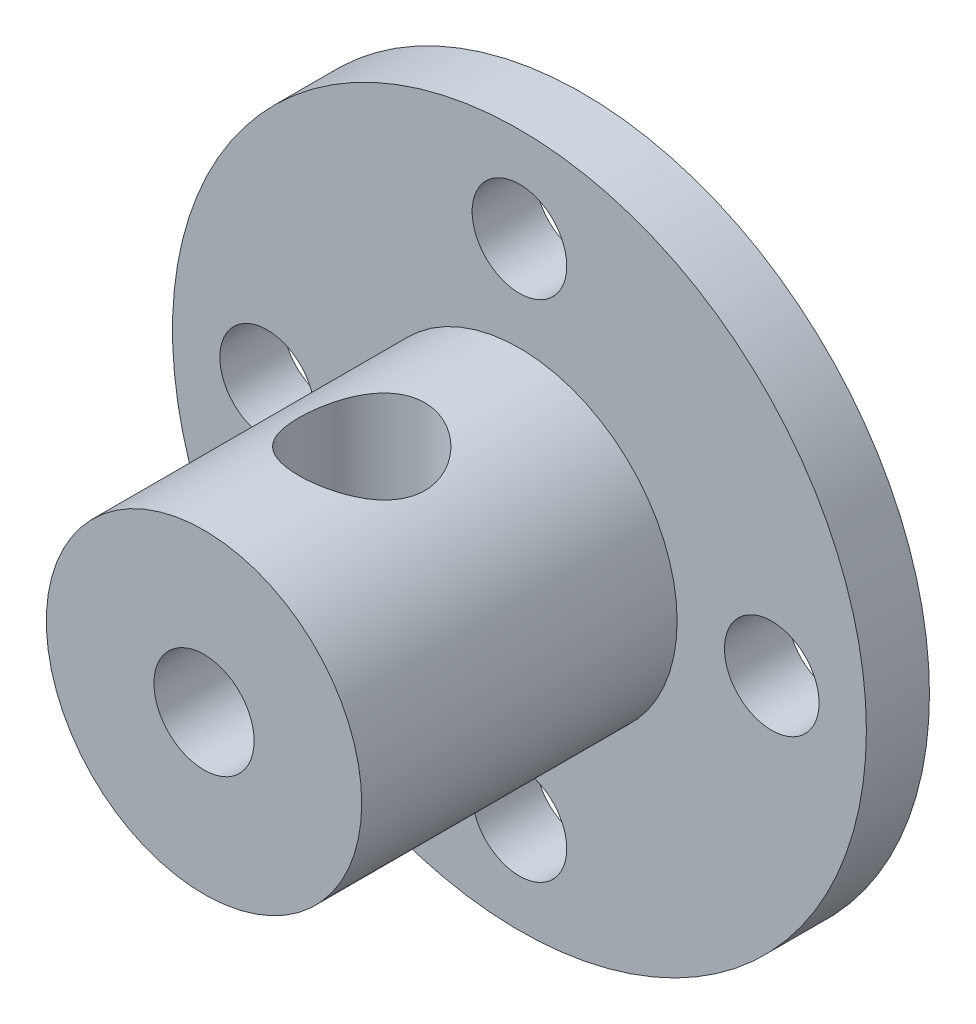
ISO-10303-21;
HEADER;
FILE_DESCRIPTION(('STEP AP214'),'2;1');
FILE_NAME('part.step','',(''),(''),'','','');
FILE_SCHEMA(('AUTOMOTIVE_DESIGN { 1 0 10303 214 1 1 1 1 }'));
ENDSEC;
DATA;
#1=APPLICATION_CONTEXT('core data for automotive mechanical design processes');
#2=APPLICATION_PROTOCOL_DEFINITION('international standard','automotive_design',2000,#1);
#3=PRODUCT_CONTEXT('',#1,'mechanical');
#4=PRODUCT('Part','Part','',(#3));
#5=PRODUCT_RELATED_PRODUCT_CATEGORY('part','',(#4));
#6=PRODUCT_DEFINITION_FORMATION('','',#4);
#7=PRODUCT_DEFINITION_CONTEXT('part definition',#1,'design');
#8=PRODUCT_DEFINITION('design','',#6,#7);
#9=PRODUCT_DEFINITION_SHAPE('','',#8);
#10=(LENGTH_UNIT() NAMED_UNIT(*) SI_UNIT(.MILLI.,.METRE.));
#11=(NAMED_UNIT(*) PLANE_ANGLE_UNIT() SI_UNIT($,.RADIAN.));
#12=(NAMED_UNIT(*) SI_UNIT($,.STERADIAN.) SOLID_ANGLE_UNIT());
#13=UNCERTAINTY_MEASURE_WITH_UNIT(LENGTH_MEASURE(1.E-05),#10,'distance_accuracy_value','');
#14=(GEOMETRIC_REPRESENTATION_CONTEXT(3) GLOBAL_UNCERTAINTY_ASSIGNED_CONTEXT((#13)) GLOBAL_UNIT_ASSIGNED_CONTEXT((#10,
#11,#12)) REPRESENTATION_CONTEXT('',''));
#15=CARTESIAN_POINT('',(0.,0.,0.));
#16=DIRECTION('',(0.,0.,1.));
#17=DIRECTION('',(1.,0.,0.));
#18=AXIS2_PLACEMENT_3D('',#15,#16,#17);
#19=CARTESIAN_POINT('',(0.,0.,12.));
#20=DIRECTION('',(0.,0.,-1.));
#21=DIRECTION('',(-1.,0.,0.));
#22=AXIS2_PLACEMENT_3D('',#19,#20,#21);
#23=CYLINDRICAL_SURFACE('',#22,1.5875);
#24=CARTESIAN_POINT('',(-1.5875,0.,8.21648828601018));
#25=CARTESIAN_POINT('',(-1.58750305562253,-0.0603104231234807,8.21648117451557));
#26=CARTESIAN_POINT('',(-1.58403341273919,-0.120607113947424,8.22105074654465));
#27=CARTESIAN_POINT('',(-1.57050160837506,-0.239301006102673,8.23840219555803));
#28=CARTESIAN_POINT('',(-1.56042477536508,-0.297693675854862,8.25120234764797));
#29=CARTESIAN_POINT('',(-1.52993691230283,-0.4307931648192,8.28842492099147));
#30=CARTESIAN_POINT('',(-1.50716925355557,-0.504242982685079,8.3153258006701));
#31=CARTESIAN_POINT('',(-1.4525517612866,-0.644963985778299,8.37540858645437));
#32=CARTESIAN_POINT('',(-1.42067534202139,-0.712216311150283,8.40860878164218));
#33=CARTESIAN_POINT('',(-1.33613167602197,-0.862998186511905,8.48972030910752));
#34=CARTESIAN_POINT('',(-1.28008952999256,-0.944048850475616,8.53873076113605));
#35=CARTESIAN_POINT('',(-1.15374980106818,-1.09483592992139,8.63560792296001));
#36=CARTESIAN_POINT('',(-1.08346397884354,-1.16458159471853,8.68347554015421));
#37=CARTESIAN_POINT('',(-0.943983199056094,-1.27887198786935,8.76467724439397));
#38=CARTESIAN_POINT('',(-0.877240483818687,-1.32567939628896,8.79902640350233));
#39=CARTESIAN_POINT('',(-0.735218433620621,-1.40938939705036,8.86157140410637));
#40=CARTESIAN_POINT('',(-0.659952550656867,-1.44630729624372,8.88977674213329));
#41=CARTESIAN_POINT('',(-0.514769487060378,-1.50341069028699,8.93386029492071));
#42=CARTESIAN_POINT('',(-0.445916459723263,-1.52532646285682,8.95098757825302));
#43=CARTESIAN_POINT('',(-0.304508928687299,-1.55971595951213,8.97798961044313));
#44=CARTESIAN_POINT('',(-0.231956443892208,-1.57219477598544,8.98786827073075));
#45=CARTESIAN_POINT('',(-0.084914925599208,-1.58695346049022,8.99956104874003));
#46=CARTESIAN_POINT('',(-0.010420259412727,-1.58919930891248,9.00134826625052));
#47=CARTESIAN_POINT('',(0.137881903001722,-1.58324116011758,8.99662040916559));
#48=CARTESIAN_POINT('',(0.211689357224325,-1.57503652829121,8.99010483037984));
#49=CARTESIAN_POINT('',(0.352561894068093,-1.54942494066314,8.96989948250185));
#50=CARTESIAN_POINT('',(0.41977774357743,-1.5325214440992,8.95660253914089));
#51=CARTESIAN_POINT('',(0.55011759343737,-1.49070994591862,8.92402924418418));
#52=CARTESIAN_POINT('',(0.613240570313924,-1.46579995138286,8.90475140390871));
#53=CARTESIAN_POINT('',(0.740387124294535,-1.40619597759525,8.85925339016223));
#54=CARTESIAN_POINT('',(0.803892757711991,-1.37078241648746,8.83253802084516));
#55=CARTESIAN_POINT('',(0.924190514464723,-1.29274029095768,8.77491651295935));
#56=CARTESIAN_POINT('',(0.9809786156286,-1.25010744070461,8.74400788718579));
#57=CARTESIAN_POINT('',(1.09852894108893,-1.14915984971797,8.67298057789703));
#58=CARTESIAN_POINT('',(1.15771236278892,-1.0894226214436,8.63227402151469));
#59=CARTESIAN_POINT('',(1.26580775172051,-0.961717373700508,8.54995008222711));
#60=CARTESIAN_POINT('',(1.31470792779573,-0.893740045043498,8.50833171350587));
#61=CARTESIAN_POINT('',(1.39688646737932,-0.757916686879353,8.432297655293));
#62=CARTESIAN_POINT('',(1.43130458852045,-0.6909201676667,8.39759896112017));
#63=CARTESIAN_POINT('',(1.49094816417341,-0.550475796251658,8.33378143644153));
#64=CARTESIAN_POINT('',(1.51619378102881,-0.477042539648627,8.3046504351143));
#65=CARTESIAN_POINT('',(1.55034106764782,-0.346068068657888,8.26370247242131));
#66=CARTESIAN_POINT('',(1.56185530066664,-0.290033197526718,8.24931546565351));
#67=CARTESIAN_POINT('',(1.5787963156751,-0.175726913483428,8.22784165465501));
#68=CARTESIAN_POINT('',(1.58423601932532,-0.117460521757196,8.22073935711978));
#69=CARTESIAN_POINT('',(1.58859239383669,5.14107138746567E-05,8.21506849756851));
#70=CARTESIAN_POINT('',(1.58747613627424,0.0593004011870496,8.21654301369272));
#71=CARTESIAN_POINT('',(1.57875288709535,0.176535995658533,8.22783702068777));
#72=CARTESIAN_POINT('',(1.57113638242224,0.23452062165419,8.23766874217348));
#73=CARTESIAN_POINT('',(1.5471491288615,0.363113583740965,8.26758811232848));
#74=CARTESIAN_POINT('',(1.52896614690763,0.432887759277852,8.2897322100792));
#75=CARTESIAN_POINT('',(1.48441719099898,0.567185240278004,8.34076600365947));
#76=CARTESIAN_POINT('',(1.45802725362809,0.631692461206863,8.36967539140858));
#77=CARTESIAN_POINT('',(1.38494972603382,0.782166513413039,8.44418578004794));
#78=CARTESIAN_POINT('',(1.33441856199001,0.865365074310069,8.49160231748909));
#79=CARTESIAN_POINT('',(1.21937505255001,1.02110336199396,8.58705619658566));
#80=CARTESIAN_POINT('',(1.15484762447235,1.09363144742334,8.63509415497001));
#81=CARTESIAN_POINT('',(1.01126908610358,1.22769671690815,8.72763382544171));
#82=CARTESIAN_POINT('',(0.932065089505583,1.28910332771994,8.7720904986264));
#83=CARTESIAN_POINT('',(0.760385029736729,1.39720232475571,8.8522181273987));
#84=CARTESIAN_POINT('',(0.667954027469525,1.44394301456274,8.88791783822903));
#85=CARTESIAN_POINT('',(0.503903562011885,1.50707633535095,8.93671595406065));
#86=CARTESIAN_POINT('',(0.435226607985624,1.52839505017955,8.95338980178295));
#87=CARTESIAN_POINT('',(0.294307841326651,1.56165422277237,8.97952000051717));
#88=CARTESIAN_POINT('',(0.222068760610799,1.57360175228297,8.9889817937853));
#89=CARTESIAN_POINT('',(0.075782722645341,1.58739643589863,8.99991335970648));
#90=CARTESIAN_POINT('',(0.00173068438304749,1.58921087729818,9.00135724802672));
#91=CARTESIAN_POINT('',(-0.145611810827035,1.58252732464204,8.99605419210823));
#92=CARTESIAN_POINT('',(-0.218902172719117,1.57402805867937,8.98930623763504));
#93=CARTESIAN_POINT('',(-0.359181569755908,1.54790321458033,8.96870205196512));
#94=CARTESIAN_POINT('',(-0.426305296656534,1.53071732171612,8.95518855486213));
#95=CARTESIAN_POINT('',(-0.556418927205157,1.48836831839192,8.92221432625772));
#96=CARTESIAN_POINT('',(-0.619407773982272,1.46320317795372,8.90275208139734));
#97=CARTESIAN_POINT('',(-0.746390854968704,1.40302513504916,8.85685374526499));
#98=CARTESIAN_POINT('',(-0.809851141861695,1.36727720627766,8.82991367537465));
#99=CARTESIAN_POINT('',(-0.930012905847546,1.28856505275451,8.77187381210532));
#100=CARTESIAN_POINT('',(-0.986710110719651,1.24559630747744,8.74077141543957));
#101=CARTESIAN_POINT('',(-1.10407049935154,1.14385437347022,8.66933120036339));
#102=CARTESIAN_POINT('',(-1.1631370324259,1.08364964481925,8.62841215938676));
#103=CARTESIAN_POINT('',(-1.27091437557708,0.954981946758358,8.5457639145379));
#104=CARTESIAN_POINT('',(-1.31961497886825,0.886510940966224,8.50403395590362));
#105=CARTESIAN_POINT('',(-1.40083541874396,0.750524277048753,8.42840598419009));
#106=CARTESIAN_POINT('',(-1.4346135341012,0.683945645461843,8.39417887142823));
#107=CARTESIAN_POINT('',(-1.49313790675603,0.544425855179249,8.33130668439768));
#108=CARTESIAN_POINT('',(-1.51789759410062,0.471494359407554,8.30265333969187));
#109=CARTESIAN_POINT('',(-1.55360986644832,0.332653307001437,8.25974099473375));
#110=CARTESIAN_POINT('',(-1.56620536244598,0.267695564952625,8.24385335036247));
#111=CARTESIAN_POINT('',(-1.58313482135486,0.135146371306106,8.22224808370633));
#112=CARTESIAN_POINT('',(-1.58749657684681,0.0675645684458493,8.21649625287627));
#113=CARTESIAN_POINT('',(-1.5875,0.,8.21648828601018));
#114=B_SPLINE_CURVE_WITH_KNOTS('',3,(#24,#25,#26,#27,#28,#29,#30,#31,#32,#33,#34,#35,#36,#37,
#38,#39,#40,#41,#42,#43,#44,#45,#46,#47,#48,#49,#50,#51,#52,#53,#54,#55,#56,#57,#58,#59,#60,#61,
#62,#63,#64,#65,#66,#67,#68,#69,#70,#71,#72,#73,#74,#75,#76,#77,#78,#79,#80,#81,#82,#83,#84,#85,
#86,#87,#88,#89,#90,#91,#92,#93,#94,#95,#96,#97,#98,#99,#100,#101,#102,#103,#104,#105,#106,#107,
#108,#109,#110,#111,#112,#113),.UNSPECIFIED.,.T.,.F.,(4,2,2,2,2,2,2,2,2,2,2,2,2,2,2,2,2,2,2,2,2,
2,2,2,2,2,2,2,2,2,2,2,2,2,2,2,2,2,2,2,2,2,2,2,4),(0.,0.180663341503489,0.361729217990144,
0.604770171580754,0.848527864116071,1.17710392805041,1.5054097917458,1.76979160038658,
2.0337618064897,2.25559358350451,2.47730556965721,2.69975410437995,2.92221614801453,
3.13304927237331,3.3439349164708,3.57548679186491,3.80717661628293,4.0864464939925,
4.36603486773454,4.61409692540232,4.86161036388957,5.03791119647268,5.21383628554633,
5.39064574128342,5.56771440076074,5.79273792493226,6.01842476212893,6.34160980408714,
6.6651448631228,6.99226186668,7.31828988739086,7.53883171001625,7.75920694535231,
7.98029320984106,8.20140674190011,8.41230687054267,8.62326069680925,8.85539339143006,
9.08767195569244,9.36789130245796,9.64838530297529,9.89405118216787,10.1393497107103,
10.3424299834461,10.544823534519),.UNSPECIFIED.);
#115=CARTESIAN_POINT('',(-1.5875,0.,8.21648828601018));
#116=VERTEX_POINT('',#115);
#117=EDGE_CURVE('E39',#116,#116,#114,.T.);
#118=ORIENTED_EDGE('',*,*,#117,.F.);
#119=EDGE_LOOP('',(#118));
#120=FACE_BOUND('',#119,.T.);
#121=CARTESIAN_POINT('',(0.,0.,12.));
#122=DIRECTION('',(0.,0.,1.));
#123=DIRECTION('',(1.,0.,0.));
#124=AXIS2_PLACEMENT_3D('',#121,#122,#123);
#125=CIRCLE('',#124,1.5875);
#126=CARTESIAN_POINT('',(1.5875,0.,12.));
#127=VERTEX_POINT('',#126);
#128=EDGE_CURVE('E132',#127,#127,#125,.T.);
#129=ORIENTED_EDGE('',*,*,#128,.T.);
#130=EDGE_LOOP('',(#129));
#131=FACE_BOUND('',#130,.T.);
#132=ADVANCED_FACE('F35',(#120,#131),#23,.F.);
#133=CARTESIAN_POINT('',(0.,0.,2.));
#134=DIRECTION('',(0.,0.,-1.));
#135=DIRECTION('',(-1.,0.,0.));
#136=AXIS2_PLACEMENT_3D('',#133,#134,#135);
#137=CYLINDRICAL_SURFACE('',#136,11.);
#138=CARTESIAN_POINT('',(0.,0.,2.));
#139=DIRECTION('',(0.,0.,1.));
#140=DIRECTION('',(1.,0.,0.));
#141=AXIS2_PLACEMENT_3D('',#138,#139,#140);
#142=CIRCLE('',#141,11.);
#143=CARTESIAN_POINT('',(11.,0.,2.));
#144=VERTEX_POINT('',#143);
#145=EDGE_CURVE('E48',#144,#144,#142,.T.);
#146=ORIENTED_EDGE('',*,*,#145,.F.);
#147=EDGE_LOOP('',(#146));
#148=FACE_BOUND('',#147,.T.);
#149=CARTESIAN_POINT('',(0.,0.,0.));
#150=DIRECTION('',(0.,0.,1.));
#151=DIRECTION('',(1.,0.,0.));
#152=AXIS2_PLACEMENT_3D('',#149,#150,#151);
#153=CIRCLE('',#152,11.);
#154=CARTESIAN_POINT('',(11.,0.,0.));
#155=VERTEX_POINT('',#154);
#156=EDGE_CURVE('E53',#155,#155,#153,.T.);
#157=ORIENTED_EDGE('',*,*,#156,.T.);
#158=EDGE_LOOP('',(#157));
#159=FACE_BOUND('',#158,.T.);
#160=ADVANCED_FACE('F37',(#148,#159),#137,.T.);
#161=CARTESIAN_POINT('',(0.,0.,2.));
#162=DIRECTION('',(0.,0.,1.));
#163=DIRECTION('',(1.,0.,0.));
#164=AXIS2_PLACEMENT_3D('',#161,#162,#163);
#165=PLANE('',#164);
#166=CARTESIAN_POINT('',(0.,8.,2.));
#167=DIRECTION('',(0.,0.,1.));
#168=DIRECTION('',(1.,0.,0.));
#169=AXIS2_PLACEMENT_3D('',#166,#167,#168);
#170=CIRCLE('',#169,1.5);
#171=CARTESIAN_POINT('',(1.5,8.,2.));
#172=VERTEX_POINT('',#171);
#173=EDGE_CURVE('E136',#172,#172,#170,.T.);
#174=ORIENTED_EDGE('',*,*,#173,.F.);
#175=EDGE_LOOP('',(#174));
#176=FACE_BOUND('',#175,.T.);
#177=CARTESIAN_POINT('',(8.,0.,2.));
#178=DIRECTION('',(0.,0.,1.));
#179=DIRECTION('',(1.,0.,0.));
#180=AXIS2_PLACEMENT_3D('',#177,#178,#179);
#181=CIRCLE('',#180,1.5);
#182=CARTESIAN_POINT('',(9.5,0.,2.));
#183=VERTEX_POINT('',#182);
#184=EDGE_CURVE('E153',#183,#183,#181,.T.);
#185=ORIENTED_EDGE('',*,*,#184,.F.);
#186=EDGE_LOOP('',(#185));
#187=FACE_BOUND('',#186,.T.);
#188=CARTESIAN_POINT('',(0.,-8.,2.));
#189=DIRECTION('',(0.,0.,1.));
#190=DIRECTION('',(1.,0.,0.));
#191=AXIS2_PLACEMENT_3D('',#188,#189,#190);
#192=CIRCLE('',#191,1.5);
#193=CARTESIAN_POINT('',(1.5,-8.,2.));
#194=VERTEX_POINT('',#193);
#195=EDGE_CURVE('E147',#194,#194,#192,.T.);
#196=ORIENTED_EDGE('',*,*,#195,.F.);
#197=EDGE_LOOP('',(#196));
#198=FACE_BOUND('',#197,.T.);
#199=CARTESIAN_POINT('',(-8.,0.,2.));
#200=DIRECTION('',(0.,0.,1.));
#201=DIRECTION('',(1.,0.,0.));
#202=AXIS2_PLACEMENT_3D('',#199,#200,#201);
#203=CIRCLE('',#202,1.5);
#204=CARTESIAN_POINT('',(-6.5,0.,2.));
#205=VERTEX_POINT('',#204);
#206=EDGE_CURVE('E141',#205,#205,#203,.T.);
#207=ORIENTED_EDGE('',*,*,#206,.F.);
#208=EDGE_LOOP('',(#207));
#209=FACE_BOUND('',#208,.T.);
#210=CARTESIAN_POINT('',(0.,0.,2.));
#211=DIRECTION('',(0.,0.,1.));
#212=DIRECTION('',(1.,0.,0.));
#213=AXIS2_PLACEMENT_3D('',#210,#211,#212);
#214=CIRCLE('',#213,5.);
#215=CARTESIAN_POINT('',(5.,0.,2.));
#216=VERTEX_POINT('',#215);
#217=EDGE_CURVE('E10',#216,#216,#214,.T.);
#218=ORIENTED_EDGE('',*,*,#217,.F.);
#219=EDGE_LOOP('',(#218));
#220=FACE_BOUND('',#219,.T.);
#221=ORIENTED_EDGE('',*,*,#145,.T.);
#222=EDGE_LOOP('',(#221));
#223=FACE_BOUND('',#222,.T.);
#224=ADVANCED_FACE('F100',(#176,#187,#198,#209,#220,#223),#165,.T.);
#225=CARTESIAN_POINT('',(0.,0.,0.));
#226=DIRECTION('',(0.,0.,1.));
#227=DIRECTION('',(1.,0.,0.));
#228=AXIS2_PLACEMENT_3D('',#225,#226,#227);
#229=PLANE('',#228);
#230=CARTESIAN_POINT('',(0.,8.,0.));
#231=DIRECTION('',(0.,0.,1.));
#232=DIRECTION('',(1.,0.,0.));
#233=AXIS2_PLACEMENT_3D('',#230,#231,#232);
#234=CIRCLE('',#233,1.5);
#235=CARTESIAN_POINT('',(1.5,8.,0.));
#236=VERTEX_POINT('',#235);
#237=EDGE_CURVE('E133',#236,#236,#234,.T.);
#238=ORIENTED_EDGE('',*,*,#237,.T.);
#239=EDGE_LOOP('',(#238));
#240=FACE_BOUND('',#239,.T.);
#241=CARTESIAN_POINT('',(8.,0.,0.));
#242=DIRECTION('',(0.,0.,1.));
#243=DIRECTION('',(1.,0.,0.));
#244=AXIS2_PLACEMENT_3D('',#241,#242,#243);
#245=CIRCLE('',#244,1.5);
#246=CARTESIAN_POINT('',(9.5,0.,0.));
#247=VERTEX_POINT('',#246);
#248=EDGE_CURVE('E150',#247,#247,#245,.T.);
#249=ORIENTED_EDGE('',*,*,#248,.T.);
#250=EDGE_LOOP('',(#249));
#251=FACE_BOUND('',#250,.T.);
#252=CARTESIAN_POINT('',(0.,-8.,0.));
#253=DIRECTION('',(0.,0.,1.));
#254=DIRECTION('',(1.,0.,0.));
#255=AXIS2_PLACEMENT_3D('',#252,#253,#254);
#256=CIRCLE('',#255,1.5);
#257=CARTESIAN_POINT('',(1.5,-8.,0.));
#258=VERTEX_POINT('',#257);
#259=EDGE_CURVE('E144',#258,#258,#256,.T.);
#260=ORIENTED_EDGE('',*,*,#259,.T.);
#261=EDGE_LOOP('',(#260));
#262=FACE_BOUND('',#261,.T.);
#263=CARTESIAN_POINT('',(-8.,0.,0.));
#264=DIRECTION('',(0.,0.,1.));
#265=DIRECTION('',(1.,0.,0.));
#266=AXIS2_PLACEMENT_3D('',#263,#264,#265);
#267=CIRCLE('',#266,1.5);
#268=CARTESIAN_POINT('',(-6.5,0.,0.));
#269=VERTEX_POINT('',#268);
#270=EDGE_CURVE('E138',#269,#269,#267,.T.);
#271=ORIENTED_EDGE('',*,*,#270,.T.);
#272=EDGE_LOOP('',(#271));
#273=FACE_BOUND('',#272,.T.);
#274=ORIENTED_EDGE('',*,*,#156,.F.);
#275=EDGE_LOOP('',(#274));
#276=FACE_BOUND('',#275,.T.);
#277=ADVANCED_FACE('F103',(#240,#251,#262,#273,#276),#229,.F.);
#278=CARTESIAN_POINT('',(0.,0.,12.));
#279=DIRECTION('',(0.,0.,1.));
#280=DIRECTION('',(1.,0.,0.));
#281=AXIS2_PLACEMENT_3D('',#278,#279,#280);
#282=PLANE('',#281);
#283=CARTESIAN_POINT('',(0.,0.,12.));
#284=DIRECTION('',(0.,0.,1.));
#285=DIRECTION('',(1.,0.,0.));
#286=AXIS2_PLACEMENT_3D('',#283,#284,#285);
#287=CIRCLE('',#286,5.);
#288=CARTESIAN_POINT('',(5.,0.,12.));
#289=VERTEX_POINT('',#288);
#290=EDGE_CURVE('E56',#289,#289,#287,.T.);
#291=ORIENTED_EDGE('',*,*,#290,.T.);
#292=EDGE_LOOP('',(#291));
#293=FACE_BOUND('',#292,.T.);
#294=ORIENTED_EDGE('',*,*,#128,.F.);
#295=EDGE_LOOP('',(#294));
#296=FACE_BOUND('',#295,.T.);
#297=ADVANCED_FACE('F98',(#293,#296),#282,.T.);
#298=CARTESIAN_POINT('',(0.,0.,12.));
#299=DIRECTION('',(0.,0.,-1.));
#300=DIRECTION('',(-1.,0.,0.));
#301=AXIS2_PLACEMENT_3D('',#298,#299,#300);
#302=CYLINDRICAL_SURFACE('',#301,5.);
#303=CARTESIAN_POINT('',(0.,-5.,9.));
#304=CARTESIAN_POINT('',(0.107493005442891,-4.99999271227085,8.99999014817628));
#305=CARTESIAN_POINT('',(0.215172564090673,-4.99649294306932,8.99128224791163));
#306=CARTESIAN_POINT('',(0.427496480417896,-4.98283453100641,8.95675229647876));
#307=CARTESIAN_POINT('',(0.532131777561248,-4.97265778698877,8.93088372091387));
#308=CARTESIAN_POINT('',(0.734953922727403,-4.94674209213118,8.86312392194117));
#309=CARTESIAN_POINT('',(0.83316066161696,-4.93102136364072,8.82128515378327));
#310=CARTESIAN_POINT('',(1.02107197032837,-4.89556610796078,8.72298082667345));
#311=CARTESIAN_POINT('',(1.11077947675099,-4.87583297458057,8.66652034508107));
#312=CARTESIAN_POINT('',(1.28350100757039,-4.83330886170419,8.53776450143906));
#313=CARTESIAN_POINT('',(1.36606227255021,-4.81042296929191,8.46489334375974));
#314=CARTESIAN_POINT('',(1.51817500478472,-4.76460576906195,8.30659999652322));
#315=CARTESIAN_POINT('',(1.58772010713353,-4.74167444453792,8.22117170278826));
#316=CARTESIAN_POINT('',(1.71487456729288,-4.69722791797136,8.03557192975773));
#317=CARTESIAN_POINT('',(1.77181498119547,-4.67582115964951,7.9349135139768));
#318=CARTESIAN_POINT('',(1.86775471903715,-4.63833647186792,7.72446360157996));
#319=CARTESIAN_POINT('',(1.90676256428583,-4.62225601244176,7.61467647215164));
#320=CARTESIAN_POINT('',(1.96389882339587,-4.59826357660818,7.3942876664079));
#321=CARTESIAN_POINT('',(1.98289396580565,-4.59001420355605,7.28394876442379));
#322=CARTESIAN_POINT('',(2.00217296164003,-4.58164004049144,7.06136500169273));
#323=CARTESIAN_POINT('',(2.00246601631322,-4.58151125522768,6.94912110537499));
#324=CARTESIAN_POINT('',(1.98498936750454,-4.58910500279994,6.73424332854196));
#325=CARTESIAN_POINT('',(1.96847531430514,-4.5962817503845,6.63148428559097));
#326=CARTESIAN_POINT('',(1.91994688029782,-4.61676187607836,6.43034044399329));
#327=CARTESIAN_POINT('',(1.88792979480463,-4.63006632321673,6.33195641188969));
#328=CARTESIAN_POINT('',(1.80869473255107,-4.6615948508853,6.13998216380396));
#329=CARTESIAN_POINT('',(1.76117986231532,-4.67991379280788,6.04653076094531));
#330=CARTESIAN_POINT('',(1.65250646073221,-4.7193811638989,5.86858418363843));
#331=CARTESIAN_POINT('',(1.59134280510084,-4.74053065456848,5.78409239059719));
#332=CARTESIAN_POINT('',(1.45155059945443,-4.78526736742271,5.619590271198));
#333=CARTESIAN_POINT('',(1.37193746297063,-4.80891664976152,5.54043127055398));
#334=CARTESIAN_POINT('',(1.20031442743019,-4.85459824958282,5.39631552199796));
#335=CARTESIAN_POINT('',(1.10830206533443,-4.87663024445325,5.33136160258971));
#336=CARTESIAN_POINT('',(0.912077652605842,-4.91714681264548,5.21638255258417));
#337=CARTESIAN_POINT('',(0.807660491346476,-4.93555270095415,5.16667771880295));
#338=CARTESIAN_POINT('',(0.591023765482881,-4.96614828328759,5.08583213892194));
#339=CARTESIAN_POINT('',(0.478808196849673,-4.97834113462382,5.05468196244259));
#340=CARTESIAN_POINT('',(0.256895887607819,-4.99456139506911,5.0135517045803));
#341=CARTESIAN_POINT('',(0.147443293985534,-4.99902945833514,5.00242754574644));
#342=CARTESIAN_POINT('',(-0.0718453098078181,-5.00068478510631,4.99828689947139));
#343=CARTESIAN_POINT('',(-0.181681213223925,-4.99787393582291,5.00526571845249));
#344=CARTESIAN_POINT('',(-0.393432739121988,-4.98557567063753,5.03629175255199));
#345=CARTESIAN_POINT('',(-0.495482491775475,-4.97639391345523,5.05955798035098));
#346=CARTESIAN_POINT('',(-0.694135428060781,-4.952594414055,5.12143570830981));
#347=CARTESIAN_POINT('',(-0.790737910224846,-4.9379759735653,5.16004917966868));
#348=CARTESIAN_POINT('',(-0.979078785816703,-4.90416594770812,5.25278493967995));
#349=CARTESIAN_POINT('',(-1.07057802275541,-4.88484815979803,5.30734547204315));
#350=CARTESIAN_POINT('',(-1.24344359124656,-4.84373364745525,5.42994032390564));
#351=CARTESIAN_POINT('',(-1.32480584076113,-4.8219359311027,5.49798004292262));
#352=CARTESIAN_POINT('',(-1.48072304302882,-4.77645117638112,5.65087001294963));
#353=CARTESIAN_POINT('',(-1.55447393380607,-4.75273441425052,5.73653354150621));
#354=CARTESIAN_POINT('',(-1.68675119741371,-4.70741672917132,5.91944008300937));
#355=CARTESIAN_POINT('',(-1.74527506133751,-4.68581615526511,6.01668500033995));
#356=CARTESIAN_POINT('',(-1.84580750193163,-4.64714299907709,6.22146169459411));
#357=CARTESIAN_POINT('',(-1.88765059453445,-4.63011630884788,6.32908399921231));
#358=CARTESIAN_POINT('',(-1.9522962197053,-4.60323673477932,6.55073365171516));
#359=CARTESIAN_POINT('',(-1.97511280526932,-4.59337855695998,6.66475620581243));
#360=CARTESIAN_POINT('',(-1.9997156172784,-4.58271759299926,6.88712790177454));
#361=CARTESIAN_POINT('',(-2.00289708230287,-4.58131421008171,6.99529483959335));
#362=CARTESIAN_POINT('',(-1.99180315927752,-4.58614836033098,7.21054485771329));
#363=CARTESIAN_POINT('',(-1.97752998791378,-4.59238492324794,7.31762807390259));
#364=CARTESIAN_POINT('',(-1.93307136615365,-4.61126649079021,7.52333218985504));
#365=CARTESIAN_POINT('',(-1.90353749357098,-4.62364831827449,7.622120274433));
#366=CARTESIAN_POINT('',(-1.83000544849101,-4.65324001232697,7.81337862961348));
#367=CARTESIAN_POINT('',(-1.78600328139381,-4.67045121206007,7.90584714689983));
#368=CARTESIAN_POINT('',(-1.68187276275973,-4.70898609604491,8.08760961927078));
#369=CARTESIAN_POINT('',(-1.62096533515949,-4.73048882313242,8.17641867013048));
#370=CARTESIAN_POINT('',(-1.4858921192715,-4.77463804372237,8.34299331720375));
#371=CARTESIAN_POINT('',(-1.41172233481812,-4.79728488048406,8.42075557212832));
#372=CARTESIAN_POINT('',(-1.24650550627246,-4.84293567087394,8.56820285326362));
#373=CARTESIAN_POINT('',(-1.15467600114614,-4.86586757962185,8.63703730689807));
#374=CARTESIAN_POINT('',(-0.959900320285777,-4.90800406713717,8.75833704262164));
#375=CARTESIAN_POINT('',(-0.856949004547235,-4.92720691092906,8.81079471215253));
#376=CARTESIAN_POINT('',(-0.644738062495201,-4.95939714815861,8.89662221519029));
#377=CARTESIAN_POINT('',(-0.535631618219694,-4.97249363055028,8.93032932356034));
#378=CARTESIAN_POINT('',(-0.312876546281219,-4.99144306209366,8.97863912095427));
#379=CARTESIAN_POINT('',(-0.199243525858911,-4.99731899495638,8.9933024367439));
#380=CARTESIAN_POINT('',(-0.0569122978909284,-4.99975899504136,8.99939538097827));
#381=CARTESIAN_POINT('',(-0.0284626887407578,-5.00000192969176,9.0000026086292));
#382=CARTESIAN_POINT('',(0.,-5.,9.));
#383=B_SPLINE_CURVE_WITH_KNOTS('',3,(#303,#304,#305,#306,#307,#308,#309,#310,#311,#312,#313,
#314,#315,#316,#317,#318,#319,#320,#321,#322,#323,#324,#325,#326,#327,#328,#329,#330,#331,#332,
#333,#334,#335,#336,#337,#338,#339,#340,#341,#342,#343,#344,#345,#346,#347,#348,#349,#350,#351,
#352,#353,#354,#355,#356,#357,#358,#359,#360,#361,#362,#363,#364,#365,#366,#367,#368,#369,#370,
#371,#372,#373,#374,#375,#376,#377,#378,#379,#380,#381,#382),.UNSPECIFIED.,.T.,.F.,(4,2,2,2,2,2,
2,2,2,2,2,2,2,2,2,2,2,2,2,2,2,2,2,2,2,2,2,2,2,2,2,2,2,2,2,2,2,2,2,4),(0.,0.322402987893071,
0.645683636007935,0.967911457471582,1.29002753567984,1.62597381700397,1.96208394934411,
2.31315258819217,2.66405423118268,2.99904105308829,3.33386306340488,3.64538328401372,
3.95695787256047,4.27489126298816,4.59294421938183,4.93558349186557,5.27829092839733,
5.62776913162806,5.9770695611379,6.30569184528007,6.63422893570082,6.94800455564365,
7.26182048993796,7.58523513398263,7.90877959498969,8.25368474624414,8.59864669043748,
8.94695045140828,9.29499672645934,9.61799673392748,9.94095572563046,10.2511431854877,
10.5614163580516,10.8894546805669,11.2175920134839,11.5670042353384,11.9165786364053,
12.2596430101332,12.6016125240434,12.686980458968),.UNSPECIFIED.);
#384=CARTESIAN_POINT('',(0.,-5.,9.));
#385=VERTEX_POINT('',#384);
#386=EDGE_CURVE('E88',#385,#385,#383,.T.);
#387=ORIENTED_EDGE('',*,*,#386,.T.);
#388=EDGE_LOOP('',(#387));
#389=FACE_BOUND('',#388,.T.);
#390=CARTESIAN_POINT('',(0.,5.,9.));
#391=CARTESIAN_POINT('',(-0.107493005442891,4.99999271227085,8.99999014817628));
#392=CARTESIAN_POINT('',(-0.215172564090673,4.99649294306932,8.99128224791163));
#393=CARTESIAN_POINT('',(-0.427496480417896,4.98283453100641,8.95675229647876));
#394=CARTESIAN_POINT('',(-0.532131777561248,4.97265778698877,8.93088372091387));
#395=CARTESIAN_POINT('',(-0.734953922727403,4.94674209213118,8.86312392194117));
#396=CARTESIAN_POINT('',(-0.83316066161696,4.93102136364072,8.82128515378327));
#397=CARTESIAN_POINT('',(-1.02107197032837,4.89556610796078,8.72298082667345));
#398=CARTESIAN_POINT('',(-1.11077947675099,4.87583297458057,8.66652034508107));
#399=CARTESIAN_POINT('',(-1.28350100757039,4.83330886170419,8.53776450143906));
#400=CARTESIAN_POINT('',(-1.36606227255021,4.81042296929191,8.46489334375974));
#401=CARTESIAN_POINT('',(-1.51817500478472,4.76460576906195,8.30659999652322));
#402=CARTESIAN_POINT('',(-1.58772010713353,4.74167444453792,8.22117170278826));
#403=CARTESIAN_POINT('',(-1.71487456729288,4.69722791797136,8.03557192975773));
#404=CARTESIAN_POINT('',(-1.77181498119547,4.67582115964951,7.9349135139768));
#405=CARTESIAN_POINT('',(-1.86775471903715,4.63833647186792,7.72446360157996));
#406=CARTESIAN_POINT('',(-1.90676256428583,4.62225601244176,7.61467647215164));
#407=CARTESIAN_POINT('',(-1.96389882339587,4.59826357660818,7.3942876664079));
#408=CARTESIAN_POINT('',(-1.98289396580565,4.59001420355605,7.28394876442379));
#409=CARTESIAN_POINT('',(-2.00217296164003,4.58164004049144,7.06136500169273));
#410=CARTESIAN_POINT('',(-2.00246601631322,4.58151125522768,6.94912110537499));
#411=CARTESIAN_POINT('',(-1.98498936750454,4.58910500279994,6.73424332854196));
#412=CARTESIAN_POINT('',(-1.96847531430514,4.5962817503845,6.63148428559097));
#413=CARTESIAN_POINT('',(-1.91994688029782,4.61676187607836,6.43034044399329));
#414=CARTESIAN_POINT('',(-1.88792979480463,4.63006632321673,6.33195641188969));
#415=CARTESIAN_POINT('',(-1.80869473255107,4.6615948508853,6.13998216380396));
#416=CARTESIAN_POINT('',(-1.76117986231532,4.67991379280788,6.04653076094531));
#417=CARTESIAN_POINT('',(-1.65250646073221,4.7193811638989,5.86858418363843));
#418=CARTESIAN_POINT('',(-1.59134280510084,4.74053065456848,5.78409239059719));
#419=CARTESIAN_POINT('',(-1.45155059945443,4.78526736742271,5.619590271198));
#420=CARTESIAN_POINT('',(-1.37193746297063,4.80891664976152,5.54043127055398));
#421=CARTESIAN_POINT('',(-1.20031442743019,4.85459824958282,5.39631552199796));
#422=CARTESIAN_POINT('',(-1.10830206533443,4.87663024445325,5.33136160258971));
#423=CARTESIAN_POINT('',(-0.912077652605842,4.91714681264548,5.21638255258417));
#424=CARTESIAN_POINT('',(-0.807660491346476,4.93555270095415,5.16667771880295));
#425=CARTESIAN_POINT('',(-0.591023765482881,4.96614828328759,5.08583213892194));
#426=CARTESIAN_POINT('',(-0.478808196849673,4.97834113462382,5.05468196244259));
#427=CARTESIAN_POINT('',(-0.256895887607819,4.99456139506911,5.0135517045803));
#428=CARTESIAN_POINT('',(-0.147443293985534,4.99902945833514,5.00242754574644));
#429=CARTESIAN_POINT('',(0.0718453098078181,5.00068478510631,4.99828689947139));
#430=CARTESIAN_POINT('',(0.181681213223925,4.99787393582291,5.00526571845249));
#431=CARTESIAN_POINT('',(0.393432739121988,4.98557567063753,5.03629175255199));
#432=CARTESIAN_POINT('',(0.495482491775475,4.97639391345523,5.05955798035098));
#433=CARTESIAN_POINT('',(0.694135428060781,4.952594414055,5.12143570830981));
#434=CARTESIAN_POINT('',(0.790737910224846,4.9379759735653,5.16004917966868));
#435=CARTESIAN_POINT('',(0.979078785816703,4.90416594770812,5.25278493967995));
#436=CARTESIAN_POINT('',(1.07057802275541,4.88484815979803,5.30734547204315));
#437=CARTESIAN_POINT('',(1.24344359124656,4.84373364745525,5.42994032390564));
#438=CARTESIAN_POINT('',(1.32480584076113,4.8219359311027,5.49798004292262));
#439=CARTESIAN_POINT('',(1.48072304302882,4.77645117638112,5.65087001294963));
#440=CARTESIAN_POINT('',(1.55447393380607,4.75273441425052,5.73653354150621));
#441=CARTESIAN_POINT('',(1.68675119741371,4.70741672917132,5.91944008300937));
#442=CARTESIAN_POINT('',(1.74527506133751,4.68581615526511,6.01668500033995));
#443=CARTESIAN_POINT('',(1.84580750193163,4.64714299907709,6.22146169459411));
#444=CARTESIAN_POINT('',(1.88765059453445,4.63011630884788,6.32908399921231));
#445=CARTESIAN_POINT('',(1.9522962197053,4.60323673477932,6.55073365171516));
#446=CARTESIAN_POINT('',(1.97511280526932,4.59337855695998,6.66475620581243));
#447=CARTESIAN_POINT('',(1.9997156172784,4.58271759299926,6.88712790177454));
#448=CARTESIAN_POINT('',(2.00289708230287,4.58131421008171,6.99529483959335));
#449=CARTESIAN_POINT('',(1.99180315927752,4.58614836033098,7.21054485771329));
#450=CARTESIAN_POINT('',(1.97752998791378,4.59238492324794,7.31762807390259));
#451=CARTESIAN_POINT('',(1.93307136615365,4.61126649079021,7.52333218985504));
#452=CARTESIAN_POINT('',(1.90353749357098,4.62364831827449,7.622120274433));
#453=CARTESIAN_POINT('',(1.83000544849101,4.65324001232697,7.81337862961348));
#454=CARTESIAN_POINT('',(1.78600328139381,4.67045121206007,7.90584714689983));
#455=CARTESIAN_POINT('',(1.68187276275973,4.70898609604491,8.08760961927078));
#456=CARTESIAN_POINT('',(1.62096533515949,4.73048882313242,8.17641867013048));
#457=CARTESIAN_POINT('',(1.4858921192715,4.77463804372237,8.34299331720375));
#458=CARTESIAN_POINT('',(1.41172233481812,4.79728488048406,8.42075557212832));
#459=CARTESIAN_POINT('',(1.24650550627246,4.84293567087394,8.56820285326362));
#460=CARTESIAN_POINT('',(1.15467600114614,4.86586757962185,8.63703730689807));
#461=CARTESIAN_POINT('',(0.959900320285777,4.90800406713717,8.75833704262164));
#462=CARTESIAN_POINT('',(0.856949004547235,4.92720691092906,8.81079471215253));
#463=CARTESIAN_POINT('',(0.644738062495201,4.95939714815861,8.89662221519029));
#464=CARTESIAN_POINT('',(0.535631618219694,4.97249363055028,8.93032932356034));
#465=CARTESIAN_POINT('',(0.312876546281219,4.99144306209366,8.97863912095427));
#466=CARTESIAN_POINT('',(0.199243525858911,4.99731899495638,8.9933024367439));
#467=CARTESIAN_POINT('',(0.0569122978909284,4.99975899504136,8.99939538097827));
#468=CARTESIAN_POINT('',(0.0284626887407578,5.00000192969176,9.0000026086292));
#469=CARTESIAN_POINT('',(0.,5.,9.));
#470=B_SPLINE_CURVE_WITH_KNOTS('',3,(#390,#391,#392,#393,#394,#395,#396,#397,#398,#399,#400,
#401,#402,#403,#404,#405,#406,#407,#408,#409,#410,#411,#412,#413,#414,#415,#416,#417,#418,#419,
#420,#421,#422,#423,#424,#425,#426,#427,#428,#429,#430,#431,#432,#433,#434,#435,#436,#437,#438,
#439,#440,#441,#442,#443,#444,#445,#446,#447,#448,#449,#450,#451,#452,#453,#454,#455,#456,#457,
#458,#459,#460,#461,#462,#463,#464,#465,#466,#467,#468,#469),.UNSPECIFIED.,.T.,.F.,(4,2,2,2,2,2,
2,2,2,2,2,2,2,2,2,2,2,2,2,2,2,2,2,2,2,2,2,2,2,2,2,2,2,2,2,2,2,2,2,4),(0.,0.322402987893071,
0.645683636007935,0.967911457471582,1.29002753567984,1.62597381700397,1.96208394934411,
2.31315258819217,2.66405423118268,2.99904105308829,3.33386306340488,3.64538328401372,
3.95695787256047,4.27489126298816,4.59294421938183,4.93558349186557,5.27829092839733,
5.62776913162806,5.9770695611379,6.30569184528007,6.63422893570082,6.94800455564365,
7.26182048993796,7.58523513398263,7.90877959498969,8.25368474624414,8.59864669043748,
8.94695045140828,9.29499672645934,9.61799673392748,9.94095572563046,10.2511431854877,
10.5614163580516,10.8894546805669,11.2175920134839,11.5670042353384,11.9165786364053,
12.2596430101332,12.6016125240434,12.686980458968),.UNSPECIFIED.);
#471=CARTESIAN_POINT('',(0.,5.,9.));
#472=VERTEX_POINT('',#471);
#473=EDGE_CURVE('E82',#472,#472,#470,.T.);
#474=ORIENTED_EDGE('',*,*,#473,.T.);
#475=EDGE_LOOP('',(#474));
#476=FACE_BOUND('',#475,.T.);
#477=ORIENTED_EDGE('',*,*,#290,.F.);
#478=EDGE_LOOP('',(#477));
#479=FACE_BOUND('',#478,.T.);
#480=ORIENTED_EDGE('',*,*,#217,.T.);
#481=EDGE_LOOP('',(#480));
#482=FACE_BOUND('',#481,.T.);
#483=ADVANCED_FACE('F93',(#389,#476,#479,#482),#302,.T.);
#484=CARTESIAN_POINT('',(-8.,0.,0.));
#485=DIRECTION('',(0.,0.,1.));
#486=DIRECTION('',(1.,0.,0.));
#487=AXIS2_PLACEMENT_3D('',#484,#485,#486);
#488=CYLINDRICAL_SURFACE('',#487,1.5);
#489=ORIENTED_EDGE('',*,*,#270,.F.);
#490=EDGE_LOOP('',(#489));
#491=FACE_BOUND('',#490,.T.);
#492=ORIENTED_EDGE('',*,*,#206,.T.);
#493=EDGE_LOOP('',(#492));
#494=FACE_BOUND('',#493,.T.);
#495=ADVANCED_FACE('F97',(#491,#494),#488,.F.);
#496=CARTESIAN_POINT('',(0.,-8.,0.));
#497=DIRECTION('',(0.,0.,1.));
#498=DIRECTION('',(1.,0.,0.));
#499=AXIS2_PLACEMENT_3D('',#496,#497,#498);
#500=CYLINDRICAL_SURFACE('',#499,1.5);
#501=ORIENTED_EDGE('',*,*,#259,.F.);
#502=EDGE_LOOP('',(#501));
#503=FACE_BOUND('',#502,.T.);
#504=ORIENTED_EDGE('',*,*,#195,.T.);
#505=EDGE_LOOP('',(#504));
#506=FACE_BOUND('',#505,.T.);
#507=ADVANCED_FACE('F173',(#503,#506),#500,.F.);
#508=CARTESIAN_POINT('',(8.,0.,0.));
#509=DIRECTION('',(0.,0.,1.));
#510=DIRECTION('',(1.,0.,0.));
#511=AXIS2_PLACEMENT_3D('',#508,#509,#510);
#512=CYLINDRICAL_SURFACE('',#511,1.5);
#513=ORIENTED_EDGE('',*,*,#248,.F.);
#514=EDGE_LOOP('',(#513));
#515=FACE_BOUND('',#514,.T.);
#516=ORIENTED_EDGE('',*,*,#184,.T.);
#517=EDGE_LOOP('',(#516));
#518=FACE_BOUND('',#517,.T.);
#519=ADVANCED_FACE('F178',(#515,#518),#512,.F.);
#520=CARTESIAN_POINT('',(0.,8.,0.));
#521=DIRECTION('',(0.,0.,1.));
#522=DIRECTION('',(1.,0.,0.));
#523=AXIS2_PLACEMENT_3D('',#520,#521,#522);
#524=CYLINDRICAL_SURFACE('',#523,1.5);
#525=ORIENTED_EDGE('',*,*,#237,.F.);
#526=EDGE_LOOP('',(#525));
#527=FACE_BOUND('',#526,.T.);
#528=ORIENTED_EDGE('',*,*,#173,.T.);
#529=EDGE_LOOP('',(#528));
#530=FACE_BOUND('',#529,.T.);
#531=ADVANCED_FACE('F74',(#527,#530),#524,.F.);
#532=CARTESIAN_POINT('',(0.,-11.,7.));
#533=DIRECTION('',(0.,1.,0.));
#534=DIRECTION('',(0.,0.,1.));
#535=AXIS2_PLACEMENT_3D('',#532,#533,#534);
#536=CYLINDRICAL_SURFACE('',#535,2.);
#537=ORIENTED_EDGE('',*,*,#473,.F.);
#538=EDGE_LOOP('',(#537));
#539=FACE_BOUND('',#538,.T.);
#540=ORIENTED_EDGE('',*,*,#117,.T.);
#541=EDGE_LOOP('',(#540));
#542=FACE_BOUND('',#541,.T.);
#543=CARTESIAN_POINT('',(-1.5875,0.,5.78351171398981));
#544=CARTESIAN_POINT('',(-1.58750305562253,0.0603104231234808,5.78351882548443));
#545=CARTESIAN_POINT('',(-1.58403341273919,0.120607113947424,5.77894925345535));
#546=CARTESIAN_POINT('',(-1.57050160837506,0.239301006102673,5.76159780444197));
#547=CARTESIAN_POINT('',(-1.56042477536508,0.297693675854862,5.74879765235203));
#548=CARTESIAN_POINT('',(-1.52993691230283,0.4307931648192,5.71157507900854));
#549=CARTESIAN_POINT('',(-1.50716925355557,0.504242982685079,5.6846741993299));
#550=CARTESIAN_POINT('',(-1.4525517612866,0.644963985778298,5.62459141354563));
#551=CARTESIAN_POINT('',(-1.42067534202139,0.712216311150283,5.59139121835782));
#552=CARTESIAN_POINT('',(-1.33613167602197,0.862998186511905,5.51027969089248));
#553=CARTESIAN_POINT('',(-1.28008952999256,0.944048850475615,5.46126923886395));
#554=CARTESIAN_POINT('',(-1.15374980106818,1.09483592992139,5.36439207703999));
#555=CARTESIAN_POINT('',(-1.08346397884355,1.16458159471853,5.31652445984579));
#556=CARTESIAN_POINT('',(-0.943983199056095,1.27887198786935,5.23532275560603));
#557=CARTESIAN_POINT('',(-0.877240483818688,1.32567939628896,5.20097359649767));
#558=CARTESIAN_POINT('',(-0.735218433620622,1.40938939705036,5.13842859589363));
#559=CARTESIAN_POINT('',(-0.659952550656868,1.44630729624372,5.11022325786671));
#560=CARTESIAN_POINT('',(-0.514769487060379,1.50341069028699,5.06613970507928));
#561=CARTESIAN_POINT('',(-0.445916459723263,1.52532646285682,5.04901242174698));
#562=CARTESIAN_POINT('',(-0.3045089286873,1.55971595951213,5.02201038955687));
#563=CARTESIAN_POINT('',(-0.231956443892209,1.57219477598544,5.01213172926925));
#564=CARTESIAN_POINT('',(-0.0849149255992089,1.58695346049022,5.00043895125997));
#565=CARTESIAN_POINT('',(-0.0104202594127278,1.58919930891248,4.99865173374948));
#566=CARTESIAN_POINT('',(0.137881903001721,1.58324116011758,5.00337959083441));
#567=CARTESIAN_POINT('',(0.211689357224324,1.57503652829121,5.00989516962016));
#568=CARTESIAN_POINT('',(0.352561894068092,1.54942494066314,5.03010051749815));
#569=CARTESIAN_POINT('',(0.419777743577428,1.5325214440992,5.04339746085911));
#570=CARTESIAN_POINT('',(0.550117593437368,1.49070994591862,5.07597075581582));
#571=CARTESIAN_POINT('',(0.613240570313923,1.46579995138286,5.09524859609129));
#572=CARTESIAN_POINT('',(0.740387124294534,1.40619597759525,5.14074660983777));
#573=CARTESIAN_POINT('',(0.80389275771199,1.37078241648746,5.16746197915484));
#574=CARTESIAN_POINT('',(0.924190514464721,1.29274029095768,5.22508348704065));
#575=CARTESIAN_POINT('',(0.980978615628599,1.25010744070461,5.25599211281421));
#576=CARTESIAN_POINT('',(1.09852894108892,1.14915984971797,5.32701942210297));
#577=CARTESIAN_POINT('',(1.15771236278892,1.0894226214436,5.36772597848531));
#578=CARTESIAN_POINT('',(1.26580775172051,0.961717373700509,5.45004991777289));
#579=CARTESIAN_POINT('',(1.31470792779573,0.8937400450435,5.49166828649413));
#580=CARTESIAN_POINT('',(1.39688646737932,0.757916686879354,5.567702344707));
#581=CARTESIAN_POINT('',(1.43130458852045,0.690920167666702,5.60240103887983));
#582=CARTESIAN_POINT('',(1.4909481641734,0.55047579625166,5.66621856355847));
#583=CARTESIAN_POINT('',(1.51619378102881,0.477042539648629,5.6953495648857));
#584=CARTESIAN_POINT('',(1.55034106764782,0.346068068657889,5.73629752757869));
#585=CARTESIAN_POINT('',(1.56185530066664,0.290033197526718,5.75068453434648));
#586=CARTESIAN_POINT('',(1.5787963156751,0.175726913483428,5.77215834534499));
#587=CARTESIAN_POINT('',(1.58423601932532,0.117460521757197,5.77926064288022));
#588=CARTESIAN_POINT('',(1.58859239383669,-5.14107138734844E-05,5.78493150243149));
#589=CARTESIAN_POINT('',(1.58747613627424,-0.0593004011870487,5.78345698630728));
#590=CARTESIAN_POINT('',(1.57875288709535,-0.176535995658533,5.77216297931223));
#591=CARTESIAN_POINT('',(1.57113638242224,-0.234520621654189,5.76233125782652));
#592=CARTESIAN_POINT('',(1.5471491288615,-0.363113583740965,5.73241188767153));
#593=CARTESIAN_POINT('',(1.52896614690763,-0.432887759277852,5.7102677899208));
#594=CARTESIAN_POINT('',(1.48441719099898,-0.567185240278004,5.65923399634053));
#595=CARTESIAN_POINT('',(1.45802725362809,-0.631692461206863,5.63032460859142));
#596=CARTESIAN_POINT('',(1.38494972603382,-0.782166513413039,5.55581421995206));
#597=CARTESIAN_POINT('',(1.33441856199001,-0.865365074310068,5.50839768251091));
#598=CARTESIAN_POINT('',(1.21937505255001,-1.02110336199396,5.41294380341434));
#599=CARTESIAN_POINT('',(1.15484762447235,-1.09363144742334,5.36490584502999));
#600=CARTESIAN_POINT('',(1.01126908610358,-1.22769671690815,5.27236617455829));
#601=CARTESIAN_POINT('',(0.932065089505583,-1.28910332771994,5.2279095013736));
#602=CARTESIAN_POINT('',(0.76038502973673,-1.39720232475571,5.1477818726013));
#603=CARTESIAN_POINT('',(0.667954027469525,-1.44394301456274,5.11208216177097));
#604=CARTESIAN_POINT('',(0.503903562011886,-1.50707633535095,5.06328404593935));
#605=CARTESIAN_POINT('',(0.435226607985625,-1.52839505017955,5.04661019821705));
#606=CARTESIAN_POINT('',(0.294307841326652,-1.56165422277237,5.02047999948283));
#607=CARTESIAN_POINT('',(0.2220687606108,-1.57360175228297,5.0110182062147));
#608=CARTESIAN_POINT('',(0.0757827226453414,-1.58739643589863,5.00008664029353));
#609=CARTESIAN_POINT('',(0.00173068438304798,-1.58921087729818,4.99864275197328));
#610=CARTESIAN_POINT('',(-0.145611810827035,-1.58252732464204,5.00394580789177));
#611=CARTESIAN_POINT('',(-0.218902172719116,-1.57402805867937,5.01069376236496));
#612=CARTESIAN_POINT('',(-0.359181569755907,-1.54790321458033,5.03129794803488));
#613=CARTESIAN_POINT('',(-0.426305296656533,-1.53071732171612,5.04481144513787));
#614=CARTESIAN_POINT('',(-0.556418927205156,-1.48836831839192,5.07778567374228));
#615=CARTESIAN_POINT('',(-0.619407773982272,-1.46320317795372,5.09724791860266));
#616=CARTESIAN_POINT('',(-0.746390854968704,-1.40302513504916,5.14314625473501));
#617=CARTESIAN_POINT('',(-0.809851141861695,-1.36727720627766,5.17008632462535));
#618=CARTESIAN_POINT('',(-0.930012905847546,-1.28856505275451,5.22812618789468));
#619=CARTESIAN_POINT('',(-0.986710110719651,-1.24559630747744,5.25922858456043));
#620=CARTESIAN_POINT('',(-1.10407049935154,-1.14385437347022,5.33066879963661));
#621=CARTESIAN_POINT('',(-1.1631370324259,-1.08364964481925,5.37158784061323));
#622=CARTESIAN_POINT('',(-1.27091437557708,-0.954981946758359,5.4542360854621));
#623=CARTESIAN_POINT('',(-1.31961497886825,-0.886510940966224,5.49596604409638));
#624=CARTESIAN_POINT('',(-1.40083541874396,-0.750524277048754,5.57159401580991));
#625=CARTESIAN_POINT('',(-1.4346135341012,-0.683945645461844,5.60582112857178));
#626=CARTESIAN_POINT('',(-1.49313790675603,-0.54442585517925,5.66869331560232));
#627=CARTESIAN_POINT('',(-1.51789759410062,-0.471494359407555,5.69734666030813));
#628=CARTESIAN_POINT('',(-1.55360986644832,-0.332653307001437,5.74025900526625));
#629=CARTESIAN_POINT('',(-1.56620536244598,-0.267695564952626,5.75614664963753));
#630=CARTESIAN_POINT('',(-1.58313482135486,-0.135146371306106,5.77775191629367));
#631=CARTESIAN_POINT('',(-1.58749657684681,-0.0675645684458493,5.78350374712373));
#632=CARTESIAN_POINT('',(-1.5875,0.,5.78351171398981));
#633=B_SPLINE_CURVE_WITH_KNOTS('',3,(#543,#544,#545,#546,#547,#548,#549,#550,#551,#552,#553,
#554,#555,#556,#557,#558,#559,#560,#561,#562,#563,#564,#565,#566,#567,#568,#569,#570,#571,#572,
#573,#574,#575,#576,#577,#578,#579,#580,#581,#582,#583,#584,#585,#586,#587,#588,#589,#590,#591,
#592,#593,#594,#595,#596,#597,#598,#599,#600,#601,#602,#603,#604,#605,#606,#607,#608,#609,#610,
#611,#612,#613,#614,#615,#616,#617,#618,#619,#620,#621,#622,#623,#624,#625,#626,#627,#628,#629,
#630,#631,#632),.UNSPECIFIED.,.T.,.F.,(4,2,2,2,2,2,2,2,2,2,2,2,2,2,2,2,2,2,2,2,2,2,2,2,2,2,2,2,
2,2,2,2,2,2,2,2,2,2,2,2,2,2,2,2,4),(0.,0.180663341503489,0.361729217990144,0.604770171580753,
0.848527864116071,1.17710392805041,1.50540979174579,1.76979160038658,2.0337618064897,
2.25559358350451,2.47730556965721,2.69975410437995,2.92221614801453,3.13304927237331,
3.3439349164708,3.57548679186491,3.80717661628293,4.0864464939925,4.36603486773453,
4.61409692540231,4.86161036388956,5.03791119647268,5.21383628554632,5.39064574128342,
5.56771440076074,5.79273792493226,6.01842476212893,6.34160980408713,6.6651448631228,
6.99226186668,7.31828988739085,7.53883171001624,7.75920694535231,7.98029320984106,
8.20140674190011,8.41230687054267,8.62326069680925,8.85539339143006,9.08767195569244,
9.36789130245796,9.64838530297529,9.89405118216787,10.1393497107103,10.3424299834461,
10.544823534519),.UNSPECIFIED.);
#634=CARTESIAN_POINT('',(-1.5875,0.,5.78351171398981));
#635=VERTEX_POINT('',#634);
#636=EDGE_CURVE('E60',#635,#635,#633,.T.);
#637=ORIENTED_EDGE('',*,*,#636,.T.);
#638=EDGE_LOOP('',(#637));
#639=FACE_BOUND('',#638,.T.);
#640=ORIENTED_EDGE('',*,*,#386,.F.);
#641=EDGE_LOOP('',(#640));
#642=FACE_BOUND('',#641,.T.);
#643=ADVANCED_FACE('F69',(#539,#542,#639,#642),#536,.F.);
#644=CARTESIAN_POINT('',(0.,0.,2.));
#645=DIRECTION('',(0.,0.,1.));
#646=DIRECTION('',(1.,0.,0.));
#647=AXIS2_PLACEMENT_3D('',#644,#645,#646);
#648=CIRCLE('',#647,1.5875);
#649=CARTESIAN_POINT('',(1.5875,0.,2.));
#650=VERTEX_POINT('',#649);
#651=EDGE_CURVE('E131',#650,#650,#648,.T.);
#652=ORIENTED_EDGE('',*,*,#651,.T.);
#653=EDGE_LOOP('',(#652));
#654=FACE_BOUND('',#653,.T.);
#655=ADVANCED_FACE('F73',(#654),#165,.T.);
#656=ORIENTED_EDGE('',*,*,#636,.F.);
#657=EDGE_LOOP('',(#656));
#658=FACE_BOUND('',#657,.T.);
#659=ORIENTED_EDGE('',*,*,#651,.F.);
#660=EDGE_LOOP('',(#659));
#661=FACE_BOUND('',#660,.T.);
#662=ADVANCED_FACE('F65',(#658,#661),#23,.F.);
#663=CLOSED_SHELL('',(#132,#160,#224,#277,#297,#483,#495,#507,#519,#531,#643,#655,#662));
#664=MANIFOLD_SOLID_BREP('B2',#663);
#665=ADVANCED_BREP_SHAPE_REPRESENTATION('',(#18,#664),#14);
#666=SHAPE_DEFINITION_REPRESENTATION(#9,#665);
ENDSEC;
END-ISO-10303-21;
